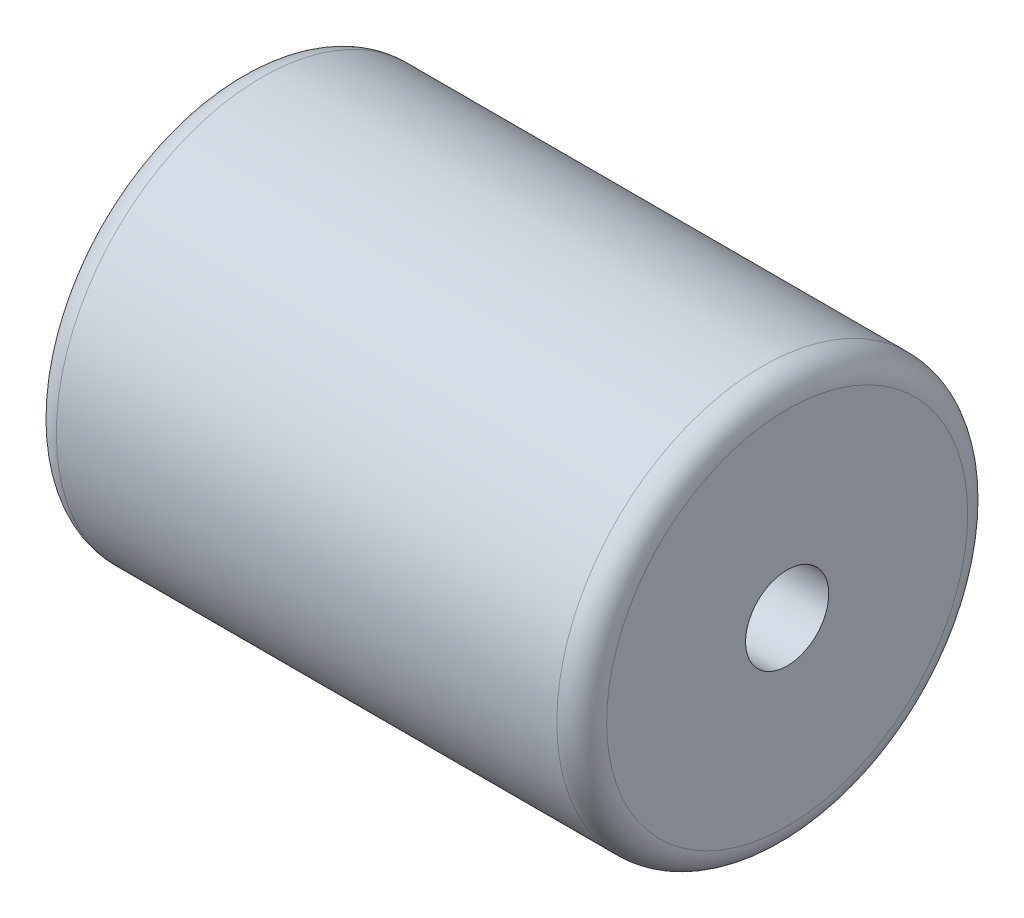
ISO-10303-21;
HEADER;
FILE_DESCRIPTION(('STEP AP214'),'2;1');
FILE_NAME('part.step','',(''),(''),'','','');
FILE_SCHEMA(('AUTOMOTIVE_DESIGN { 1 0 10303 214 1 1 1 1 }'));
ENDSEC;
DATA;
#1=APPLICATION_CONTEXT('core data for automotive mechanical design processes');
#2=APPLICATION_PROTOCOL_DEFINITION('international standard','automotive_design',2000,#1);
#3=PRODUCT_CONTEXT('',#1,'mechanical');
#4=PRODUCT('Part','Part','',(#3));
#5=PRODUCT_RELATED_PRODUCT_CATEGORY('part','',(#4));
#6=PRODUCT_DEFINITION_FORMATION('','',#4);
#7=PRODUCT_DEFINITION_CONTEXT('part definition',#1,'design');
#8=PRODUCT_DEFINITION('design','',#6,#7);
#9=PRODUCT_DEFINITION_SHAPE('','',#8);
#10=(LENGTH_UNIT() NAMED_UNIT(*) SI_UNIT(.MILLI.,.METRE.));
#11=(NAMED_UNIT(*) PLANE_ANGLE_UNIT() SI_UNIT($,.RADIAN.));
#12=(NAMED_UNIT(*) SI_UNIT($,.STERADIAN.) SOLID_ANGLE_UNIT());
#13=UNCERTAINTY_MEASURE_WITH_UNIT(LENGTH_MEASURE(1.E-05),#10,'distance_accuracy_value','');
#14=(GEOMETRIC_REPRESENTATION_CONTEXT(3) GLOBAL_UNCERTAINTY_ASSIGNED_CONTEXT((#13)) GLOBAL_UNIT_ASSIGNED_CONTEXT((#10,
#11,#12)) REPRESENTATION_CONTEXT('',''));
#15=CARTESIAN_POINT('',(0.,0.,0.));
#16=DIRECTION('',(0.,0.,1.));
#17=DIRECTION('',(1.,0.,0.));
#18=AXIS2_PLACEMENT_3D('',#15,#16,#17);
#19=CARTESIAN_POINT('',(14.0335,0.,0.));
#20=DIRECTION('',(1.,0.,0.));
#21=DIRECTION('',(0.,0.,-1.));
#22=AXIS2_PLACEMENT_3D('',#19,#20,#21);
#23=PLANE('',#22);
#24=CARTESIAN_POINT('',(14.0335,0.,0.));
#25=DIRECTION('',(1.,0.,0.));
#26=DIRECTION('',(0.,0.,-1.));
#27=AXIS2_PLACEMENT_3D('',#24,#25,#26);
#28=CIRCLE('',#27,4.60375);
#29=CARTESIAN_POINT('',(14.0335,0.,-4.60375));
#30=VERTEX_POINT('',#29);
#31=EDGE_CURVE('E10',#30,#30,#28,.T.);
#32=ORIENTED_EDGE('',*,*,#31,.T.);
#33=EDGE_LOOP('',(#32));
#34=FACE_BOUND('',#33,.T.);
#35=CARTESIAN_POINT('',(14.0335,0.,0.));
#36=DIRECTION('',(1.,0.,0.));
#37=DIRECTION('',(0.,0.,-1.));
#38=AXIS2_PLACEMENT_3D('',#35,#36,#37);
#39=CIRCLE('',#38,1.06045);
#40=CARTESIAN_POINT('',(14.0335,0.,-1.06045));
#41=VERTEX_POINT('',#40);
#42=EDGE_CURVE('E65',#41,#41,#39,.T.);
#43=ORIENTED_EDGE('',*,*,#42,.F.);
#44=EDGE_LOOP('',(#43));
#45=FACE_BOUND('',#44,.T.);
#46=ADVANCED_FACE('F41',(#34,#45),#23,.T.);
#47=CARTESIAN_POINT('',(0.,0.,0.));
#48=DIRECTION('',(1.,0.,0.));
#49=DIRECTION('',(0.,0.,-1.));
#50=AXIS2_PLACEMENT_3D('',#47,#48,#49);
#51=PLANE('',#50);
#52=CARTESIAN_POINT('',(0.,0.,0.));
#53=DIRECTION('',(1.,0.,0.));
#54=DIRECTION('',(0.,0.,-1.));
#55=AXIS2_PLACEMENT_3D('',#52,#53,#54);
#56=CIRCLE('',#55,4.60375);
#57=CARTESIAN_POINT('',(0.,0.,-4.60375));
#58=VERTEX_POINT('',#57);
#59=EDGE_CURVE('E49',#58,#58,#56,.F.);
#60=ORIENTED_EDGE('',*,*,#59,.T.);
#61=EDGE_LOOP('',(#60));
#62=FACE_BOUND('',#61,.T.);
#63=CARTESIAN_POINT('',(0.,0.,0.));
#64=DIRECTION('',(1.,0.,0.));
#65=DIRECTION('',(0.,0.,-1.));
#66=AXIS2_PLACEMENT_3D('',#63,#64,#65);
#67=CIRCLE('',#66,1.06045);
#68=CARTESIAN_POINT('',(0.,0.,-1.06045));
#69=VERTEX_POINT('',#68);
#70=EDGE_CURVE('E66',#69,#69,#67,.T.);
#71=ORIENTED_EDGE('',*,*,#70,.T.);
#72=EDGE_LOOP('',(#71));
#73=FACE_BOUND('',#72,.T.);
#74=ADVANCED_FACE('F78',(#62,#73),#51,.F.);
#75=CARTESIAN_POINT('',(14.0335,0.,0.));
#76=DIRECTION('',(-1.,0.,0.));
#77=DIRECTION('',(0.,0.,1.));
#78=AXIS2_PLACEMENT_3D('',#75,#76,#77);
#79=CYLINDRICAL_SURFACE('',#78,5.23875);
#80=CARTESIAN_POINT('',(0.635,0.,0.));
#81=DIRECTION('',(1.,0.,0.));
#82=DIRECTION('',(0.,0.,-1.));
#83=AXIS2_PLACEMENT_3D('',#80,#81,#82);
#84=CIRCLE('',#83,5.23875);
#85=CARTESIAN_POINT('',(0.635,0.,-5.23875));
#86=VERTEX_POINT('',#85);
#87=EDGE_CURVE('E54',#86,#86,#84,.T.);
#88=ORIENTED_EDGE('',*,*,#87,.T.);
#89=EDGE_LOOP('',(#88));
#90=FACE_BOUND('',#89,.T.);
#91=CARTESIAN_POINT('',(13.3985,0.,0.));
#92=DIRECTION('',(1.,0.,0.));
#93=DIRECTION('',(0.,0.,-1.));
#94=AXIS2_PLACEMENT_3D('',#91,#92,#93);
#95=CIRCLE('',#94,5.23875);
#96=CARTESIAN_POINT('',(13.3985,0.,-5.23875));
#97=VERTEX_POINT('',#96);
#98=EDGE_CURVE('E59',#97,#97,#95,.F.);
#99=ORIENTED_EDGE('',*,*,#98,.T.);
#100=EDGE_LOOP('',(#99));
#101=FACE_BOUND('',#100,.T.);
#102=ADVANCED_FACE('F84',(#90,#101),#79,.T.);
#103=CARTESIAN_POINT('',(14.0335,0.,0.));
#104=DIRECTION('',(-1.,0.,0.));
#105=DIRECTION('',(0.,0.,1.));
#106=AXIS2_PLACEMENT_3D('',#103,#104,#105);
#107=CYLINDRICAL_SURFACE('',#106,1.06045);
#108=ORIENTED_EDGE('',*,*,#42,.T.);
#109=EDGE_LOOP('',(#108));
#110=FACE_BOUND('',#109,.T.);
#111=ORIENTED_EDGE('',*,*,#70,.F.);
#112=EDGE_LOOP('',(#111));
#113=FACE_BOUND('',#112,.T.);
#114=ADVANCED_FACE('F74',(#110,#113),#107,.F.);
#115=CARTESIAN_POINT('',(0.635,0.,0.));
#116=DIRECTION('',(1.,0.,0.));
#117=DIRECTION('',(0.,0.,-1.));
#118=AXIS2_PLACEMENT_3D('',#115,#116,#117);
#119=TOROIDAL_SURFACE('',#118,4.60375,0.635);
#120=ORIENTED_EDGE('',*,*,#59,.F.);
#121=EDGE_LOOP('',(#120));
#122=FACE_BOUND('',#121,.T.);
#123=ORIENTED_EDGE('',*,*,#87,.F.);
#124=EDGE_LOOP('',(#123));
#125=FACE_BOUND('',#124,.T.);
#126=ADVANCED_FACE('F90',(#122,#125),#119,.T.);
#127=CARTESIAN_POINT('',(13.3985,0.,0.));
#128=DIRECTION('',(1.,0.,0.));
#129=DIRECTION('',(0.,0.,-1.));
#130=AXIS2_PLACEMENT_3D('',#127,#128,#129);
#131=TOROIDAL_SURFACE('',#130,4.60375,0.635);
#132=ORIENTED_EDGE('',*,*,#98,.F.);
#133=EDGE_LOOP('',(#132));
#134=FACE_BOUND('',#133,.T.);
#135=ORIENTED_EDGE('',*,*,#31,.F.);
#136=EDGE_LOOP('',(#135));
#137=FACE_BOUND('',#136,.T.);
#138=ADVANCED_FACE('F43',(#134,#137),#131,.T.);
#139=CLOSED_SHELL('',(#46,#74,#102,#114,#126,#138));
#140=MANIFOLD_SOLID_BREP('B2',#139);
#141=ADVANCED_BREP_SHAPE_REPRESENTATION('',(#18,#140),#14);
#142=SHAPE_DEFINITION_REPRESENTATION(#9,#141);
ENDSEC;
END-ISO-10303-21;
